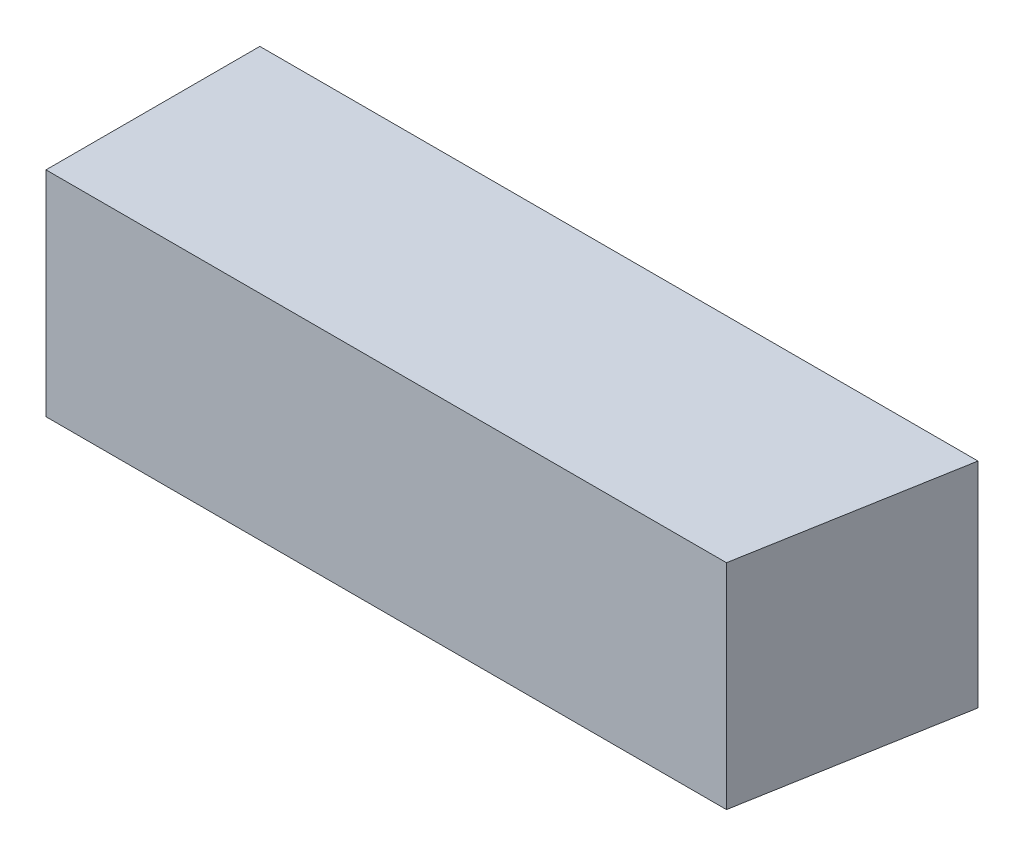
ISO-10303-21;
HEADER;
FILE_DESCRIPTION(('STEP AP214'),'2;1');
FILE_NAME('part.step','',(''),(''),'','','');
FILE_SCHEMA(('AUTOMOTIVE_DESIGN { 1 0 10303 214 1 1 1 1 }'));
ENDSEC;
DATA;
#1=APPLICATION_CONTEXT('core data for automotive mechanical design processes');
#2=APPLICATION_PROTOCOL_DEFINITION('international standard','automotive_design',2000,#1);
#3=PRODUCT_CONTEXT('',#1,'mechanical');
#4=PRODUCT('Part','Part','',(#3));
#5=PRODUCT_RELATED_PRODUCT_CATEGORY('part','',(#4));
#6=PRODUCT_DEFINITION_FORMATION('','',#4);
#7=PRODUCT_DEFINITION_CONTEXT('part definition',#1,'design');
#8=PRODUCT_DEFINITION('design','',#6,#7);
#9=PRODUCT_DEFINITION_SHAPE('','',#8);
#10=(LENGTH_UNIT() NAMED_UNIT(*) SI_UNIT(.MILLI.,.METRE.));
#11=(NAMED_UNIT(*) PLANE_ANGLE_UNIT() SI_UNIT($,.RADIAN.));
#12=(NAMED_UNIT(*) SI_UNIT($,.STERADIAN.) SOLID_ANGLE_UNIT());
#13=UNCERTAINTY_MEASURE_WITH_UNIT(LENGTH_MEASURE(1.E-05),#10,'distance_accuracy_value','');
#14=(GEOMETRIC_REPRESENTATION_CONTEXT(3) GLOBAL_UNCERTAINTY_ASSIGNED_CONTEXT((#13)) GLOBAL_UNIT_ASSIGNED_CONTEXT((#10,
#11,#12)) REPRESENTATION_CONTEXT('',''));
#15=CARTESIAN_POINT('',(0.,0.,0.));
#16=DIRECTION('',(0.,0.,1.));
#17=DIRECTION('',(1.,0.,0.));
#18=AXIS2_PLACEMENT_3D('',#15,#16,#17);
#19=CARTESIAN_POINT('',(298.577,0.,0.));
#20=DIRECTION('',(0.,1.,0.));
#21=DIRECTION('',(0.,0.,1.));
#22=AXIS2_PLACEMENT_3D('',#19,#20,#21);
#23=PLANE('',#22);
#24=DIRECTION('',(-0.173622407885694,0.,0.984812296572283));
#25=VECTOR('',#24,1.);
#26=CARTESIAN_POINT('',(298.577,0.,0.));
#27=LINE('',#26,#25);
#28=CARTESIAN_POINT('',(298.577,0.,0.));
#29=VERTEX_POINT('',#28);
#30=CARTESIAN_POINT('',(282.90393,0.,88.9));
#31=VERTEX_POINT('',#30);
#32=EDGE_CURVE('E61',#29,#31,#27,.T.);
#33=ORIENTED_EDGE('',*,*,#32,.T.);
#34=DIRECTION('',(-1.,0.,0.));
#35=VECTOR('',#34,1.);
#36=CARTESIAN_POINT('',(298.577,0.,88.9));
#37=LINE('',#36,#35);
#38=CARTESIAN_POINT('',(0.,0.,88.9));
#39=VERTEX_POINT('',#38);
#40=EDGE_CURVE('E91',#31,#39,#37,.T.);
#41=ORIENTED_EDGE('',*,*,#40,.T.);
#42=DIRECTION('',(0.,0.,-1.));
#43=VECTOR('',#42,1.);
#44=CARTESIAN_POINT('',(0.,0.,0.));
#45=LINE('',#44,#43);
#46=CARTESIAN_POINT('',(0.,0.,0.));
#47=VERTEX_POINT('',#46);
#48=EDGE_CURVE('E104',#39,#47,#45,.T.);
#49=ORIENTED_EDGE('',*,*,#48,.T.);
#50=DIRECTION('',(-1.,0.,0.));
#51=VECTOR('',#50,1.);
#52=CARTESIAN_POINT('',(298.577,0.,0.));
#53=LINE('',#52,#51);
#54=EDGE_CURVE('E11',#29,#47,#53,.T.);
#55=ORIENTED_EDGE('',*,*,#54,.F.);
#56=EDGE_LOOP('',(#33,#41,#49,#55));
#57=FACE_BOUND('',#56,.T.);
#58=ADVANCED_FACE('F45',(#57),#23,.F.);
#59=CARTESIAN_POINT('',(298.577,88.9,0.));
#60=DIRECTION('',(0.,-1.,0.));
#61=DIRECTION('',(0.,0.,-1.));
#62=AXIS2_PLACEMENT_3D('',#59,#60,#61);
#63=PLANE('',#62);
#64=DIRECTION('',(-0.173622407885694,0.,0.984812296572283));
#65=VECTOR('',#64,1.);
#66=CARTESIAN_POINT('',(298.577,88.9,0.));
#67=LINE('',#66,#65);
#68=CARTESIAN_POINT('',(298.577,88.9,0.));
#69=VERTEX_POINT('',#68);
#70=CARTESIAN_POINT('',(282.90393,88.9,88.9));
#71=VERTEX_POINT('',#70);
#72=EDGE_CURVE('E119',#69,#71,#67,.T.);
#73=ORIENTED_EDGE('',*,*,#72,.F.);
#74=DIRECTION('',(-1.,0.,0.));
#75=VECTOR('',#74,1.);
#76=CARTESIAN_POINT('',(298.577,88.9,0.));
#77=LINE('',#76,#75);
#78=CARTESIAN_POINT('',(0.,88.9,0.));
#79=VERTEX_POINT('',#78);
#80=EDGE_CURVE('E54',#69,#79,#77,.T.);
#81=ORIENTED_EDGE('',*,*,#80,.T.);
#82=DIRECTION('',(0.,0.,1.));
#83=VECTOR('',#82,1.);
#84=CARTESIAN_POINT('',(0.,88.9,0.));
#85=LINE('',#84,#83);
#86=CARTESIAN_POINT('',(0.,88.9,88.9));
#87=VERTEX_POINT('',#86);
#88=EDGE_CURVE('E95',#79,#87,#85,.T.);
#89=ORIENTED_EDGE('',*,*,#88,.T.);
#90=DIRECTION('',(-1.,0.,0.));
#91=VECTOR('',#90,1.);
#92=CARTESIAN_POINT('',(298.577,88.9,88.9));
#93=LINE('',#92,#91);
#94=EDGE_CURVE('E80',#71,#87,#93,.T.);
#95=ORIENTED_EDGE('',*,*,#94,.F.);
#96=EDGE_LOOP('',(#73,#81,#89,#95));
#97=FACE_BOUND('',#96,.T.);
#98=ADVANCED_FACE('F96',(#97),#63,.F.);
#99=CARTESIAN_POINT('',(298.577,0.,88.9));
#100=DIRECTION('',(0.,0.,-1.));
#101=DIRECTION('',(-1.,0.,0.));
#102=AXIS2_PLACEMENT_3D('',#99,#100,#101);
#103=PLANE('',#102);
#104=DIRECTION('',(0.,-1.,0.));
#105=VECTOR('',#104,1.);
#106=CARTESIAN_POINT('',(282.90393,88.9,88.9));
#107=LINE('',#106,#105);
#108=EDGE_CURVE('E87',#71,#31,#107,.T.);
#109=ORIENTED_EDGE('',*,*,#108,.F.);
#110=ORIENTED_EDGE('',*,*,#94,.T.);
#111=DIRECTION('',(0.,-1.,0.));
#112=VECTOR('',#111,1.);
#113=CARTESIAN_POINT('',(0.,0.,88.9));
#114=LINE('',#113,#112);
#115=EDGE_CURVE('E85',#87,#39,#114,.T.);
#116=ORIENTED_EDGE('',*,*,#115,.T.);
#117=ORIENTED_EDGE('',*,*,#40,.F.);
#118=EDGE_LOOP('',(#109,#110,#116,#117));
#119=FACE_BOUND('',#118,.T.);
#120=ADVANCED_FACE('F82',(#119),#103,.F.);
#121=CARTESIAN_POINT('',(298.577,0.,0.));
#122=DIRECTION('',(0.,0.,1.));
#123=DIRECTION('',(1.,0.,0.));
#124=AXIS2_PLACEMENT_3D('',#121,#122,#123);
#125=PLANE('',#124);
#126=DIRECTION('',(0.,1.,0.));
#127=VECTOR('',#126,1.);
#128=CARTESIAN_POINT('',(0.,0.,0.));
#129=LINE('',#128,#127);
#130=EDGE_CURVE('E100',#47,#79,#129,.T.);
#131=ORIENTED_EDGE('',*,*,#130,.T.);
#132=ORIENTED_EDGE('',*,*,#80,.F.);
#133=DIRECTION('',(0.,1.,0.));
#134=VECTOR('',#133,1.);
#135=CARTESIAN_POINT('',(298.577,0.,0.));
#136=LINE('',#135,#134);
#137=EDGE_CURVE('E106',#29,#69,#136,.T.);
#138=ORIENTED_EDGE('',*,*,#137,.F.);
#139=ORIENTED_EDGE('',*,*,#54,.T.);
#140=EDGE_LOOP('',(#131,#132,#138,#139));
#141=FACE_BOUND('',#140,.T.);
#142=ADVANCED_FACE('F131',(#141),#125,.F.);
#143=CARTESIAN_POINT('',(0.,0.,0.));
#144=DIRECTION('',(-1.,0.,0.));
#145=DIRECTION('',(0.,0.,1.));
#146=AXIS2_PLACEMENT_3D('',#143,#144,#145);
#147=PLANE('',#146);
#148=ORIENTED_EDGE('',*,*,#48,.F.);
#149=ORIENTED_EDGE('',*,*,#115,.F.);
#150=ORIENTED_EDGE('',*,*,#88,.F.);
#151=ORIENTED_EDGE('',*,*,#130,.F.);
#152=EDGE_LOOP('',(#148,#149,#150,#151));
#153=FACE_BOUND('',#152,.T.);
#154=ADVANCED_FACE('F102',(#153),#147,.T.);
#155=CARTESIAN_POINT('',(298.577,88.9,0.));
#156=DIRECTION('',(0.984812296572283,0.,0.173622407885694));
#157=DIRECTION('',(0.173622407885694,0.,-0.984812296572283));
#158=AXIS2_PLACEMENT_3D('',#155,#156,#157);
#159=PLANE('',#158);
#160=ORIENTED_EDGE('',*,*,#32,.F.);
#161=ORIENTED_EDGE('',*,*,#137,.T.);
#162=ORIENTED_EDGE('',*,*,#72,.T.);
#163=ORIENTED_EDGE('',*,*,#108,.T.);
#164=EDGE_LOOP('',(#160,#161,#162,#163));
#165=FACE_BOUND('',#164,.T.);
#166=ADVANCED_FACE('F120',(#165),#159,.T.);
#167=CLOSED_SHELL('',(#58,#98,#120,#142,#154,#166));
#168=MANIFOLD_SOLID_BREP('B2',#167);
#169=ADVANCED_BREP_SHAPE_REPRESENTATION('',(#18,#168),#14);
#170=SHAPE_DEFINITION_REPRESENTATION(#9,#169);
ENDSEC;
END-ISO-10303-21;
